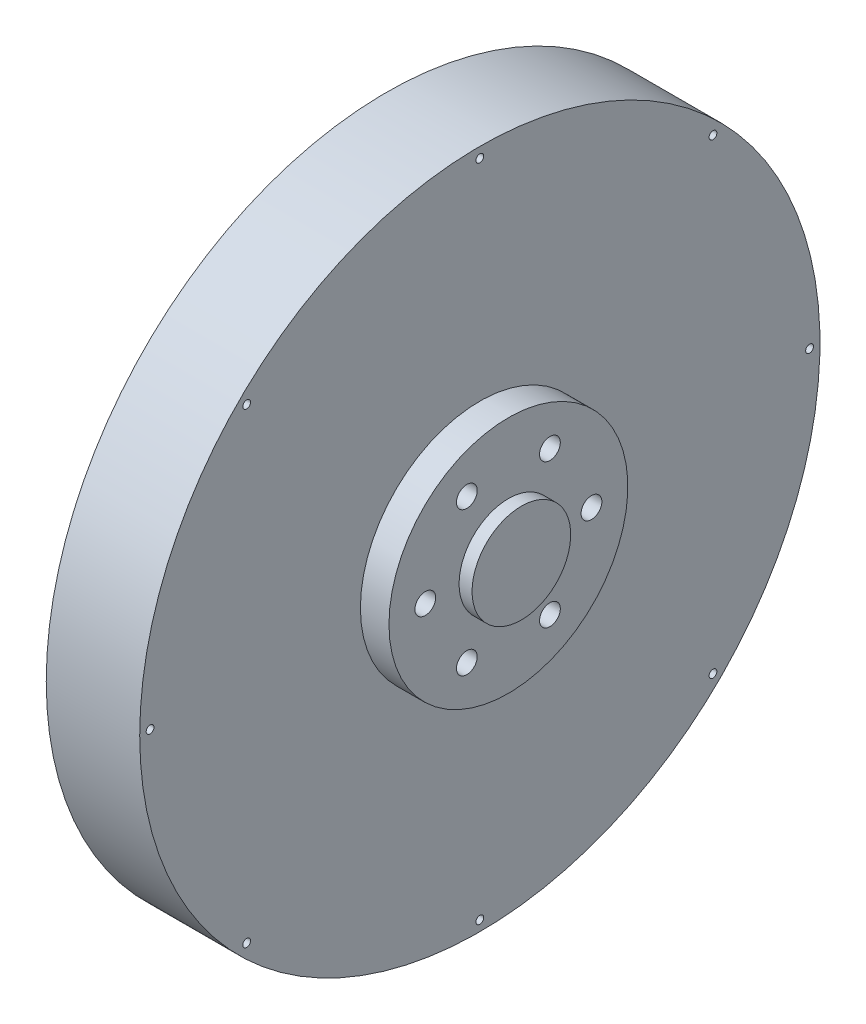
ISO-10303-21;
HEADER;
FILE_DESCRIPTION(('STEP AP214'),'2;1');
FILE_NAME('part.step','',(''),(''),'','','');
FILE_SCHEMA(('AUTOMOTIVE_DESIGN { 1 0 10303 214 1 1 1 1 }'));
ENDSEC;
DATA;
#1=APPLICATION_CONTEXT('core data for automotive mechanical design processes');
#2=APPLICATION_PROTOCOL_DEFINITION('international standard','automotive_design',2000,#1);
#3=PRODUCT_CONTEXT('',#1,'mechanical');
#4=PRODUCT('Part','Part','',(#3));
#5=PRODUCT_RELATED_PRODUCT_CATEGORY('part','',(#4));
#6=PRODUCT_DEFINITION_FORMATION('','',#4);
#7=PRODUCT_DEFINITION_CONTEXT('part definition',#1,'design');
#8=PRODUCT_DEFINITION('design','',#6,#7);
#9=PRODUCT_DEFINITION_SHAPE('','',#8);
#10=(LENGTH_UNIT() NAMED_UNIT(*) SI_UNIT(.MILLI.,.METRE.));
#11=(NAMED_UNIT(*) PLANE_ANGLE_UNIT() SI_UNIT($,.RADIAN.));
#12=(NAMED_UNIT(*) SI_UNIT($,.STERADIAN.) SOLID_ANGLE_UNIT());
#13=UNCERTAINTY_MEASURE_WITH_UNIT(LENGTH_MEASURE(1.E-05),#10,'distance_accuracy_value','');
#14=(GEOMETRIC_REPRESENTATION_CONTEXT(3) GLOBAL_UNCERTAINTY_ASSIGNED_CONTEXT((#13)) GLOBAL_UNIT_ASSIGNED_CONTEXT((#10,
#11,#12)) REPRESENTATION_CONTEXT('',''));
#15=CARTESIAN_POINT('',(0.,0.,0.));
#16=DIRECTION('',(0.,0.,1.));
#17=DIRECTION('',(1.,0.,0.));
#18=AXIS2_PLACEMENT_3D('',#15,#16,#17);
#19=CARTESIAN_POINT('',(11.,0.,0.));
#20=DIRECTION('',(1.,0.,0.));
#21=DIRECTION('',(0.,0.,1.));
#22=AXIS2_PLACEMENT_3D('',#19,#20,#21);
#23=PLANE('',#22);
#24=CARTESIAN_POINT('',(11.,-27.7128129211019,16.0000000000003));
#25=DIRECTION('',(-1.,0.,0.));
#26=DIRECTION('',(0.,-0.866025403784433,0.50000000000001));
#27=AXIS2_PLACEMENT_3D('',#24,#25,#26);
#28=CIRCLE('',#27,4.00000000000001);
#29=CARTESIAN_POINT('',(11.,-31.1769145362396,18.0000000000004));
#30=VERTEX_POINT('',#29);
#31=EDGE_CURVE('E142',#30,#30,#28,.T.);
#32=ORIENTED_EDGE('',*,*,#31,.T.);
#33=EDGE_LOOP('',(#32));
#34=FACE_BOUND('',#33,.T.);
#35=CARTESIAN_POINT('',(11.,-27.7128129211022,-15.9999999999997));
#36=DIRECTION('',(-1.,0.,0.));
#37=DIRECTION('',(0.,-0.866025403784443,-0.499999999999992));
#38=AXIS2_PLACEMENT_3D('',#35,#36,#37);
#39=CIRCLE('',#38,4.00000000000001);
#40=CARTESIAN_POINT('',(11.,-31.17691453624,-17.9999999999997));
#41=VERTEX_POINT('',#40);
#42=EDGE_CURVE('E136',#41,#41,#39,.T.);
#43=ORIENTED_EDGE('',*,*,#42,.T.);
#44=EDGE_LOOP('',(#43));
#45=FACE_BOUND('',#44,.T.);
#46=CARTESIAN_POINT('',(11.,0.,-32.));
#47=DIRECTION('',(-1.,0.,0.));
#48=DIRECTION('',(0.,0.,-1.));
#49=AXIS2_PLACEMENT_3D('',#46,#47,#48);
#50=CIRCLE('',#49,4.00000000000001);
#51=CARTESIAN_POINT('',(11.,0.,-36.));
#52=VERTEX_POINT('',#51);
#53=EDGE_CURVE('E130',#52,#52,#50,.T.);
#54=ORIENTED_EDGE('',*,*,#53,.T.);
#55=EDGE_LOOP('',(#54));
#56=FACE_BOUND('',#55,.T.);
#57=CARTESIAN_POINT('',(11.,27.712812921102,-16.0000000000001));
#58=DIRECTION('',(-1.,0.,0.));
#59=DIRECTION('',(0.,0.866025403784436,-0.500000000000004));
#60=AXIS2_PLACEMENT_3D('',#57,#58,#59);
#61=CIRCLE('',#60,4.00000000000001);
#62=CARTESIAN_POINT('',(11.,31.1769145362397,-18.0000000000002));
#63=VERTEX_POINT('',#62);
#64=EDGE_CURVE('E124',#63,#63,#61,.T.);
#65=ORIENTED_EDGE('',*,*,#64,.T.);
#66=EDGE_LOOP('',(#65));
#67=FACE_BOUND('',#66,.T.);
#68=CARTESIAN_POINT('',(11.,27.7128129211021,15.9999999999999));
#69=DIRECTION('',(-1.,0.,0.));
#70=DIRECTION('',(0.,0.86602540378444,0.499999999999998));
#71=AXIS2_PLACEMENT_3D('',#68,#69,#70);
#72=CIRCLE('',#71,4.00000000000001);
#73=CARTESIAN_POINT('',(11.,31.1769145362398,17.9999999999999));
#74=VERTEX_POINT('',#73);
#75=EDGE_CURVE('E118',#74,#74,#72,.T.);
#76=ORIENTED_EDGE('',*,*,#75,.T.);
#77=EDGE_LOOP('',(#76));
#78=FACE_BOUND('',#77,.T.);
#79=CARTESIAN_POINT('',(11.,0.,32.));
#80=DIRECTION('',(-1.,0.,0.));
#81=DIRECTION('',(0.,0.,1.));
#82=AXIS2_PLACEMENT_3D('',#79,#80,#81);
#83=CIRCLE('',#82,4.00000000000001);
#84=CARTESIAN_POINT('',(11.,0.,36.));
#85=VERTEX_POINT('',#84);
#86=EDGE_CURVE('E112',#85,#85,#83,.T.);
#87=ORIENTED_EDGE('',*,*,#86,.T.);
#88=EDGE_LOOP('',(#87));
#89=FACE_BOUND('',#88,.T.);
#90=CARTESIAN_POINT('',(11.,0.,0.));
#91=DIRECTION('',(-1.,0.,0.));
#92=DIRECTION('',(0.,0.,1.));
#93=AXIS2_PLACEMENT_3D('',#90,#91,#92);
#94=CIRCLE('',#93,46.);
#95=CARTESIAN_POINT('',(11.,0.,46.));
#96=VERTEX_POINT('',#95);
#97=EDGE_CURVE('E97',#96,#96,#94,.T.);
#98=ORIENTED_EDGE('',*,*,#97,.F.);
#99=EDGE_LOOP('',(#98));
#100=FACE_BOUND('',#99,.T.);
#101=CARTESIAN_POINT('',(11.,0.,0.));
#102=DIRECTION('',(-1.,0.,0.));
#103=DIRECTION('',(0.,0.,1.));
#104=AXIS2_PLACEMENT_3D('',#101,#102,#103);
#105=CIRCLE('',#104,19.);
#106=CARTESIAN_POINT('',(11.,0.,19.));
#107=VERTEX_POINT('',#106);
#108=EDGE_CURVE('E104',#107,#107,#105,.T.);
#109=ORIENTED_EDGE('',*,*,#108,.T.);
#110=EDGE_LOOP('',(#109));
#111=FACE_BOUND('',#110,.T.);
#112=ADVANCED_FACE('F35',(#34,#45,#56,#67,#78,#89,#100,#111),#23,.T.);
#113=CARTESIAN_POINT('',(0.,0.,0.));
#114=DIRECTION('',(1.,0.,0.));
#115=DIRECTION('',(0.,0.,1.));
#116=AXIS2_PLACEMENT_3D('',#113,#114,#115);
#117=PLANE('',#116);
#118=CARTESIAN_POINT('',(0.,-89.8025612106904,89.8025612106926));
#119=DIRECTION('',(-1.,0.,0.));
#120=DIRECTION('',(0.,-0.707106781186539,0.707106781186556));
#121=AXIS2_PLACEMENT_3D('',#118,#119,#120);
#122=CIRCLE('',#121,1.5);
#123=CARTESIAN_POINT('',(0.,-90.8632213824702,90.8632213824725));
#124=VERTEX_POINT('',#123);
#125=EDGE_CURVE('E190',#124,#124,#122,.T.);
#126=ORIENTED_EDGE('',*,*,#125,.T.);
#127=EDGE_LOOP('',(#126));
#128=FACE_BOUND('',#127,.T.);
#129=CARTESIAN_POINT('',(0.,-127.,1.33025439009923E-12));
#130=DIRECTION('',(-1.,0.,0.));
#131=DIRECTION('',(0.,-1.,0.));
#132=AXIS2_PLACEMENT_3D('',#129,#130,#131);
#133=CIRCLE('',#132,1.5);
#134=CARTESIAN_POINT('',(0.,-128.5,1.34596605612403E-12));
#135=VERTEX_POINT('',#134);
#136=EDGE_CURVE('E184',#135,#135,#133,.T.);
#137=ORIENTED_EDGE('',*,*,#136,.T.);
#138=EDGE_LOOP('',(#137));
#139=FACE_BOUND('',#138,.T.);
#140=CARTESIAN_POINT('',(0.,-89.8025612106923,-89.8025612106908));
#141=DIRECTION('',(-1.,0.,0.));
#142=DIRECTION('',(0.,-0.707106781186554,-0.707106781186541));
#143=AXIS2_PLACEMENT_3D('',#140,#141,#142);
#144=CIRCLE('',#143,1.5);
#145=CARTESIAN_POINT('',(0.,-90.8632213824721,-90.8632213824706));
#146=VERTEX_POINT('',#145);
#147=EDGE_CURVE('E178',#146,#146,#144,.T.);
#148=ORIENTED_EDGE('',*,*,#147,.T.);
#149=EDGE_LOOP('',(#148));
#150=FACE_BOUND('',#149,.T.);
#151=CARTESIAN_POINT('',(0.,0.,-127.));
#152=DIRECTION('',(-1.,0.,0.));
#153=DIRECTION('',(0.,0.,-1.));
#154=AXIS2_PLACEMENT_3D('',#151,#152,#153);
#155=CIRCLE('',#154,1.5);
#156=CARTESIAN_POINT('',(0.,0.,-128.5));
#157=VERTEX_POINT('',#156);
#158=EDGE_CURVE('E172',#157,#157,#155,.T.);
#159=ORIENTED_EDGE('',*,*,#158,.T.);
#160=EDGE_LOOP('',(#159));
#161=FACE_BOUND('',#160,.T.);
#162=CARTESIAN_POINT('',(0.,89.8025612106911,-89.802561210692));
#163=DIRECTION('',(-1.,0.,0.));
#164=DIRECTION('',(0.,0.707106781186544,-0.707106781186551));
#165=AXIS2_PLACEMENT_3D('',#162,#163,#164);
#166=CIRCLE('',#165,1.5);
#167=CARTESIAN_POINT('',(0.,90.8632213824709,-90.8632213824718));
#168=VERTEX_POINT('',#167);
#169=EDGE_CURVE('E166',#168,#168,#166,.T.);
#170=ORIENTED_EDGE('',*,*,#169,.T.);
#171=EDGE_LOOP('',(#170));
#172=FACE_BOUND('',#171,.T.);
#173=CARTESIAN_POINT('',(0.,127.,-4.43418130033078E-13));
#174=DIRECTION('',(-1.,0.,0.));
#175=DIRECTION('',(0.,1.,0.));
#176=AXIS2_PLACEMENT_3D('',#173,#174,#175);
#177=CIRCLE('',#176,1.5);
#178=CARTESIAN_POINT('',(0.,128.5,-4.48655352041343E-13));
#179=VERTEX_POINT('',#178);
#180=EDGE_CURVE('E160',#179,#179,#177,.T.);
#181=ORIENTED_EDGE('',*,*,#180,.T.);
#182=EDGE_LOOP('',(#181));
#183=FACE_BOUND('',#182,.T.);
#184=CARTESIAN_POINT('',(0.,89.8025612106917,89.8025612106914));
#185=DIRECTION('',(-1.,0.,0.));
#186=DIRECTION('',(0.,0.707106781186549,0.707106781186546));
#187=AXIS2_PLACEMENT_3D('',#184,#185,#186);
#188=CIRCLE('',#187,1.5);
#189=CARTESIAN_POINT('',(0.,90.8632213824715,90.8632213824712));
#190=VERTEX_POINT('',#189);
#191=EDGE_CURVE('E154',#190,#190,#188,.T.);
#192=ORIENTED_EDGE('',*,*,#191,.T.);
#193=EDGE_LOOP('',(#192));
#194=FACE_BOUND('',#193,.T.);
#195=CARTESIAN_POINT('',(0.,0.,127.));
#196=DIRECTION('',(-1.,0.,0.));
#197=DIRECTION('',(0.,0.,1.));
#198=AXIS2_PLACEMENT_3D('',#195,#196,#197);
#199=CIRCLE('',#198,1.5);
#200=CARTESIAN_POINT('',(0.,0.,128.5));
#201=VERTEX_POINT('',#200);
#202=EDGE_CURVE('E146',#201,#201,#199,.T.);
#203=ORIENTED_EDGE('',*,*,#202,.T.);
#204=EDGE_LOOP('',(#203));
#205=FACE_BOUND('',#204,.T.);
#206=CARTESIAN_POINT('',(0.,0.,0.));
#207=DIRECTION('',(-1.,0.,0.));
#208=DIRECTION('',(0.,0.,1.));
#209=AXIS2_PLACEMENT_3D('',#206,#207,#208);
#210=CIRCLE('',#209,131.);
#211=CARTESIAN_POINT('',(0.,0.,131.));
#212=VERTEX_POINT('',#211);
#213=EDGE_CURVE('E65',#212,#212,#210,.T.);
#214=ORIENTED_EDGE('',*,*,#213,.F.);
#215=EDGE_LOOP('',(#214));
#216=FACE_BOUND('',#215,.T.);
#217=CARTESIAN_POINT('',(0.,0.,0.));
#218=DIRECTION('',(-1.,0.,0.));
#219=DIRECTION('',(0.,0.,1.));
#220=AXIS2_PLACEMENT_3D('',#217,#218,#219);
#221=CIRCLE('',#220,46.);
#222=CARTESIAN_POINT('',(0.,0.,46.));
#223=VERTEX_POINT('',#222);
#224=EDGE_CURVE('E98',#223,#223,#221,.T.);
#225=ORIENTED_EDGE('',*,*,#224,.T.);
#226=EDGE_LOOP('',(#225));
#227=FACE_BOUND('',#226,.T.);
#228=ADVANCED_FACE('F194',(#128,#139,#150,#161,#172,#183,#194,#205,#216,#227),#117,.T.);
#229=CARTESIAN_POINT('',(-36.,0.,0.));
#230=DIRECTION('',(1.,0.,0.));
#231=DIRECTION('',(0.,0.,1.));
#232=AXIS2_PLACEMENT_3D('',#229,#230,#231);
#233=PLANE('',#232);
#234=CARTESIAN_POINT('',(-36.,-50.2294734194977,28.9999999999995));
#235=DIRECTION('',(-1.,0.,0.));
#236=DIRECTION('',(0.,0.,1.));
#237=AXIS2_PLACEMENT_3D('',#234,#235,#236);
#238=CIRCLE('',#237,4.);
#239=CARTESIAN_POINT('',(-36.,-50.2294734194977,32.9999999999995));
#240=VERTEX_POINT('',#239);
#241=EDGE_CURVE('E42',#240,#240,#238,.F.);
#242=ORIENTED_EDGE('',*,*,#241,.T.);
#243=EDGE_LOOP('',(#242));
#244=FACE_BOUND('',#243,.T.);
#245=CARTESIAN_POINT('',(-36.,50.2294734194973,29.0000000000002));
#246=DIRECTION('',(-1.,0.,0.));
#247=DIRECTION('',(0.,0.,1.));
#248=AXIS2_PLACEMENT_3D('',#245,#246,#247);
#249=CIRCLE('',#248,4.);
#250=CARTESIAN_POINT('',(-36.,50.2294734194973,33.0000000000002));
#251=VERTEX_POINT('',#250);
#252=EDGE_CURVE('E50',#251,#251,#249,.F.);
#253=ORIENTED_EDGE('',*,*,#252,.T.);
#254=EDGE_LOOP('',(#253));
#255=FACE_BOUND('',#254,.T.);
#256=CARTESIAN_POINT('',(-36.,0.,-58.));
#257=DIRECTION('',(-1.,0.,0.));
#258=DIRECTION('',(0.,0.,1.));
#259=AXIS2_PLACEMENT_3D('',#256,#257,#258);
#260=CIRCLE('',#259,4.);
#261=CARTESIAN_POINT('',(-36.,0.,-54.));
#262=VERTEX_POINT('',#261);
#263=EDGE_CURVE('E58',#262,#262,#260,.F.);
#264=ORIENTED_EDGE('',*,*,#263,.T.);
#265=EDGE_LOOP('',(#264));
#266=FACE_BOUND('',#265,.T.);
#267=CARTESIAN_POINT('',(-36.,0.,0.));
#268=DIRECTION('',(-1.,0.,0.));
#269=DIRECTION('',(0.,0.,1.));
#270=AXIS2_PLACEMENT_3D('',#267,#268,#269);
#271=CIRCLE('',#270,131.);
#272=CARTESIAN_POINT('',(-36.,0.,131.));
#273=VERTEX_POINT('',#272);
#274=EDGE_CURVE('E64',#273,#273,#271,.T.);
#275=ORIENTED_EDGE('',*,*,#274,.T.);
#276=EDGE_LOOP('',(#275));
#277=FACE_BOUND('',#276,.T.);
#278=CARTESIAN_POINT('',(-36.,0.,0.));
#279=DIRECTION('',(-1.,0.,0.));
#280=DIRECTION('',(0.,0.,1.));
#281=AXIS2_PLACEMENT_3D('',#278,#279,#280);
#282=CIRCLE('',#281,47.);
#283=CARTESIAN_POINT('',(-36.,0.,47.));
#284=VERTEX_POINT('',#283);
#285=EDGE_CURVE('E61',#284,#284,#282,.F.);
#286=ORIENTED_EDGE('',*,*,#285,.T.);
#287=EDGE_LOOP('',(#286));
#288=FACE_BOUND('',#287,.T.);
#289=CARTESIAN_POINT('',(-36.,50.2294734194975,-28.9999999999999));
#290=DIRECTION('',(-1.,0.,0.));
#291=DIRECTION('',(0.,0.,1.));
#292=AXIS2_PLACEMENT_3D('',#289,#290,#291);
#293=CIRCLE('',#292,4.);
#294=CARTESIAN_POINT('',(-36.,50.2294734194975,-24.9999999999999));
#295=VERTEX_POINT('',#294);
#296=EDGE_CURVE('E55',#295,#295,#293,.F.);
#297=ORIENTED_EDGE('',*,*,#296,.T.);
#298=EDGE_LOOP('',(#297));
#299=FACE_BOUND('',#298,.T.);
#300=CARTESIAN_POINT('',(-36.,0.,58.));
#301=DIRECTION('',(-1.,0.,0.));
#302=DIRECTION('',(0.,0.,1.));
#303=AXIS2_PLACEMENT_3D('',#300,#301,#302);
#304=CIRCLE('',#303,4.);
#305=CARTESIAN_POINT('',(-36.,0.,62.));
#306=VERTEX_POINT('',#305);
#307=EDGE_CURVE('E46',#306,#306,#304,.F.);
#308=ORIENTED_EDGE('',*,*,#307,.T.);
#309=EDGE_LOOP('',(#308));
#310=FACE_BOUND('',#309,.T.);
#311=CARTESIAN_POINT('',(-36.,-50.2294734194971,-29.0000000000006));
#312=DIRECTION('',(-1.,0.,0.));
#313=DIRECTION('',(0.,0.,1.));
#314=AXIS2_PLACEMENT_3D('',#311,#312,#313);
#315=CIRCLE('',#314,4.);
#316=CARTESIAN_POINT('',(-36.,-50.2294734194971,-25.0000000000006));
#317=VERTEX_POINT('',#316);
#318=EDGE_CURVE('E10',#317,#317,#315,.F.);
#319=ORIENTED_EDGE('',*,*,#318,.T.);
#320=EDGE_LOOP('',(#319));
#321=FACE_BOUND('',#320,.T.);
#322=ADVANCED_FACE('F218',(#244,#255,#266,#277,#288,#299,#310,#321),#233,.F.);
#323=CARTESIAN_POINT('',(-57.5,0.,0.));
#324=DIRECTION('',(-1.,0.,0.));
#325=DIRECTION('',(0.,0.,-1.));
#326=AXIS2_PLACEMENT_3D('',#323,#324,#325);
#327=PLANE('',#326);
#328=CARTESIAN_POINT('',(-57.5,0.,0.));
#329=DIRECTION('',(1.,0.,0.));
#330=DIRECTION('',(0.,0.,-1.));
#331=AXIS2_PLACEMENT_3D('',#328,#329,#330);
#332=CIRCLE('',#331,47.);
#333=CARTESIAN_POINT('',(-57.5,0.,-47.));
#334=VERTEX_POINT('',#333);
#335=EDGE_CURVE('E68',#334,#334,#332,.T.);
#336=ORIENTED_EDGE('',*,*,#335,.F.);
#337=EDGE_LOOP('',(#336));
#338=FACE_BOUND('',#337,.T.);
#339=CARTESIAN_POINT('',(-57.5,0.,0.));
#340=DIRECTION('',(1.,0.,0.));
#341=DIRECTION('',(0.,0.,-1.));
#342=AXIS2_PLACEMENT_3D('',#339,#340,#341);
#343=CIRCLE('',#342,36.5);
#344=CARTESIAN_POINT('',(-57.5,0.,-36.5));
#345=VERTEX_POINT('',#344);
#346=EDGE_CURVE('E74',#345,#345,#343,.T.);
#347=ORIENTED_EDGE('',*,*,#346,.T.);
#348=EDGE_LOOP('',(#347));
#349=FACE_BOUND('',#348,.T.);
#350=ADVANCED_FACE('F285',(#338,#349),#327,.T.);
#351=CARTESIAN_POINT('',(-36.,0.,0.));
#352=DIRECTION('',(1.,0.,0.));
#353=DIRECTION('',(0.,0.,1.));
#354=AXIS2_PLACEMENT_3D('',#351,#352,#353);
#355=CYLINDRICAL_SURFACE('',#354,131.);
#356=ORIENTED_EDGE('',*,*,#274,.F.);
#357=EDGE_LOOP('',(#356));
#358=FACE_BOUND('',#357,.T.);
#359=ORIENTED_EDGE('',*,*,#213,.T.);
#360=EDGE_LOOP('',(#359));
#361=FACE_BOUND('',#360,.T.);
#362=ADVANCED_FACE('F37',(#358,#361),#355,.T.);
#363=CARTESIAN_POINT('',(-57.5,0.,0.));
#364=DIRECTION('',(1.,0.,0.));
#365=DIRECTION('',(0.,0.,1.));
#366=AXIS2_PLACEMENT_3D('',#363,#364,#365);
#367=CYLINDRICAL_SURFACE('',#366,47.);
#368=ORIENTED_EDGE('',*,*,#335,.T.);
#369=EDGE_LOOP('',(#368));
#370=FACE_BOUND('',#369,.T.);
#371=ORIENTED_EDGE('',*,*,#285,.F.);
#372=EDGE_LOOP('',(#371));
#373=FACE_BOUND('',#372,.T.);
#374=ADVANCED_FACE('F283',(#370,#373),#367,.T.);
#375=CARTESIAN_POINT('',(-70.,0.,0.));
#376=DIRECTION('',(1.,0.,0.));
#377=DIRECTION('',(0.,0.,1.));
#378=AXIS2_PLACEMENT_3D('',#375,#376,#377);
#379=CYLINDRICAL_SURFACE('',#378,36.5);
#380=CARTESIAN_POINT('',(-70.,0.,0.));
#381=DIRECTION('',(1.,0.,0.));
#382=DIRECTION('',(0.,0.,-1.));
#383=AXIS2_PLACEMENT_3D('',#380,#381,#382);
#384=CIRCLE('',#383,36.5);
#385=CARTESIAN_POINT('',(-70.,0.,-36.5));
#386=VERTEX_POINT('',#385);
#387=EDGE_CURVE('E73',#386,#386,#384,.T.);
#388=ORIENTED_EDGE('',*,*,#387,.T.);
#389=EDGE_LOOP('',(#388));
#390=FACE_BOUND('',#389,.T.);
#391=ORIENTED_EDGE('',*,*,#346,.F.);
#392=EDGE_LOOP('',(#391));
#393=FACE_BOUND('',#392,.T.);
#394=ADVANCED_FACE('F279',(#390,#393),#379,.T.);
#395=CARTESIAN_POINT('',(-70.,0.,0.));
#396=DIRECTION('',(-1.,0.,0.));
#397=DIRECTION('',(0.,0.,-1.));
#398=AXIS2_PLACEMENT_3D('',#395,#396,#397);
#399=PLANE('',#398);
#400=ORIENTED_EDGE('',*,*,#387,.F.);
#401=EDGE_LOOP('',(#400));
#402=FACE_BOUND('',#401,.T.);
#403=ADVANCED_FACE('F275',(#402),#399,.T.);
#404=CARTESIAN_POINT('',(-40.,0.,-58.));
#405=DIRECTION('',(1.,0.,0.));
#406=DIRECTION('',(0.,0.,1.));
#407=AXIS2_PLACEMENT_3D('',#404,#405,#406);
#408=CYLINDRICAL_SURFACE('',#407,4.);
#409=CARTESIAN_POINT('',(-40.,0.,-58.));
#410=DIRECTION('',(1.,0.,0.));
#411=DIRECTION('',(0.,0.,-1.));
#412=AXIS2_PLACEMENT_3D('',#409,#410,#411);
#413=CIRCLE('',#412,4.);
#414=CARTESIAN_POINT('',(-40.,0.,-62.));
#415=VERTEX_POINT('',#414);
#416=EDGE_CURVE('E77',#415,#415,#413,.T.);
#417=ORIENTED_EDGE('',*,*,#416,.T.);
#418=EDGE_LOOP('',(#417));
#419=FACE_BOUND('',#418,.T.);
#420=ORIENTED_EDGE('',*,*,#263,.F.);
#421=EDGE_LOOP('',(#420));
#422=FACE_BOUND('',#421,.T.);
#423=ADVANCED_FACE('F271',(#419,#422),#408,.T.);
#424=CARTESIAN_POINT('',(-40.,0.,-58.));
#425=DIRECTION('',(-1.,0.,0.));
#426=DIRECTION('',(0.,0.,-1.));
#427=AXIS2_PLACEMENT_3D('',#424,#425,#426);
#428=PLANE('',#427);
#429=ORIENTED_EDGE('',*,*,#416,.F.);
#430=EDGE_LOOP('',(#429));
#431=FACE_BOUND('',#430,.T.);
#432=ADVANCED_FACE('F267',(#431),#428,.T.);
#433=CARTESIAN_POINT('',(-40.,50.2294734194975,-28.9999999999999));
#434=DIRECTION('',(1.,0.,0.));
#435=DIRECTION('',(0.,-0.86602540378444,0.499999999999998));
#436=AXIS2_PLACEMENT_3D('',#433,#434,#435);
#437=CYLINDRICAL_SURFACE('',#436,4.);
#438=CARTESIAN_POINT('',(-40.,50.2294734194975,-28.9999999999999));
#439=DIRECTION('',(1.,0.,0.));
#440=DIRECTION('',(0.,0.86602540378444,-0.499999999999998));
#441=AXIS2_PLACEMENT_3D('',#438,#439,#440);
#442=CIRCLE('',#441,4.);
#443=CARTESIAN_POINT('',(-40.,53.6935750346353,-30.9999999999999));
#444=VERTEX_POINT('',#443);
#445=EDGE_CURVE('E82',#444,#444,#442,.T.);
#446=ORIENTED_EDGE('',*,*,#445,.T.);
#447=EDGE_LOOP('',(#446));
#448=FACE_BOUND('',#447,.T.);
#449=ORIENTED_EDGE('',*,*,#296,.F.);
#450=EDGE_LOOP('',(#449));
#451=FACE_BOUND('',#450,.T.);
#452=ADVANCED_FACE('F263',(#448,#451),#437,.T.);
#453=CARTESIAN_POINT('',(-40.,50.2294734194975,-28.9999999999999));
#454=DIRECTION('',(-1.,0.,0.));
#455=DIRECTION('',(0.,0.86602540378444,-0.499999999999998));
#456=AXIS2_PLACEMENT_3D('',#453,#454,#455);
#457=PLANE('',#456);
#458=ORIENTED_EDGE('',*,*,#445,.F.);
#459=EDGE_LOOP('',(#458));
#460=FACE_BOUND('',#459,.T.);
#461=ADVANCED_FACE('F259',(#460),#457,.T.);
#462=CARTESIAN_POINT('',(-40.,50.2294734194973,29.0000000000002));
#463=DIRECTION('',(1.,0.,0.));
#464=DIRECTION('',(0.,-0.866025403784436,-0.500000000000004));
#465=AXIS2_PLACEMENT_3D('',#462,#463,#464);
#466=CYLINDRICAL_SURFACE('',#465,4.);
#467=CARTESIAN_POINT('',(-40.,50.2294734194973,29.0000000000002));
#468=DIRECTION('',(1.,0.,0.));
#469=DIRECTION('',(0.,0.866025403784436,0.500000000000004));
#470=AXIS2_PLACEMENT_3D('',#467,#468,#469);
#471=CIRCLE('',#470,4.);
#472=CARTESIAN_POINT('',(-40.,53.6935750346351,31.0000000000003));
#473=VERTEX_POINT('',#472);
#474=EDGE_CURVE('E85',#473,#473,#471,.T.);
#475=ORIENTED_EDGE('',*,*,#474,.T.);
#476=EDGE_LOOP('',(#475));
#477=FACE_BOUND('',#476,.T.);
#478=ORIENTED_EDGE('',*,*,#252,.F.);
#479=EDGE_LOOP('',(#478));
#480=FACE_BOUND('',#479,.T.);
#481=ADVANCED_FACE('F255',(#477,#480),#466,.T.);
#482=CARTESIAN_POINT('',(-40.,50.2294734194973,29.0000000000002));
#483=DIRECTION('',(-1.,0.,0.));
#484=DIRECTION('',(0.,0.866025403784436,0.500000000000004));
#485=AXIS2_PLACEMENT_3D('',#482,#483,#484);
#486=PLANE('',#485);
#487=ORIENTED_EDGE('',*,*,#474,.F.);
#488=EDGE_LOOP('',(#487));
#489=FACE_BOUND('',#488,.T.);
#490=ADVANCED_FACE('F251',(#489),#486,.T.);
#491=CARTESIAN_POINT('',(-40.,0.,58.));
#492=DIRECTION('',(1.,0.,0.));
#493=DIRECTION('',(0.,0.,-1.));
#494=AXIS2_PLACEMENT_3D('',#491,#492,#493);
#495=CYLINDRICAL_SURFACE('',#494,4.);
#496=CARTESIAN_POINT('',(-40.,0.,58.));
#497=DIRECTION('',(1.,0.,0.));
#498=DIRECTION('',(0.,0.,1.));
#499=AXIS2_PLACEMENT_3D('',#496,#497,#498);
#500=CIRCLE('',#499,4.);
#501=CARTESIAN_POINT('',(-40.,0.,62.));
#502=VERTEX_POINT('',#501);
#503=EDGE_CURVE('E88',#502,#502,#500,.T.);
#504=ORIENTED_EDGE('',*,*,#503,.T.);
#505=EDGE_LOOP('',(#504));
#506=FACE_BOUND('',#505,.T.);
#507=ORIENTED_EDGE('',*,*,#307,.F.);
#508=EDGE_LOOP('',(#507));
#509=FACE_BOUND('',#508,.T.);
#510=ADVANCED_FACE('F247',(#506,#509),#495,.T.);
#511=CARTESIAN_POINT('',(-40.,0.,58.));
#512=DIRECTION('',(-1.,0.,0.));
#513=DIRECTION('',(0.,0.,1.));
#514=AXIS2_PLACEMENT_3D('',#511,#512,#513);
#515=PLANE('',#514);
#516=ORIENTED_EDGE('',*,*,#503,.F.);
#517=EDGE_LOOP('',(#516));
#518=FACE_BOUND('',#517,.T.);
#519=ADVANCED_FACE('F243',(#518),#515,.T.);
#520=CARTESIAN_POINT('',(-40.,-50.2294734194977,28.9999999999995));
#521=DIRECTION('',(1.,0.,0.));
#522=DIRECTION('',(0.,0.866025403784443,-0.499999999999992));
#523=AXIS2_PLACEMENT_3D('',#520,#521,#522);
#524=CYLINDRICAL_SURFACE('',#523,4.);
#525=CARTESIAN_POINT('',(-40.,-50.2294734194977,28.9999999999995));
#526=DIRECTION('',(1.,0.,0.));
#527=DIRECTION('',(0.,-0.866025403784443,0.499999999999992));
#528=AXIS2_PLACEMENT_3D('',#525,#526,#527);
#529=CIRCLE('',#528,4.);
#530=CARTESIAN_POINT('',(-40.,-53.6935750346355,30.9999999999995));
#531=VERTEX_POINT('',#530);
#532=EDGE_CURVE('E91',#531,#531,#529,.T.);
#533=ORIENTED_EDGE('',*,*,#532,.T.);
#534=EDGE_LOOP('',(#533));
#535=FACE_BOUND('',#534,.T.);
#536=ORIENTED_EDGE('',*,*,#241,.F.);
#537=EDGE_LOOP('',(#536));
#538=FACE_BOUND('',#537,.T.);
#539=ADVANCED_FACE('F239',(#535,#538),#524,.T.);
#540=CARTESIAN_POINT('',(-40.,-50.2294734194977,28.9999999999995));
#541=DIRECTION('',(-1.,0.,0.));
#542=DIRECTION('',(0.,-0.866025403784443,0.499999999999992));
#543=AXIS2_PLACEMENT_3D('',#540,#541,#542);
#544=PLANE('',#543);
#545=ORIENTED_EDGE('',*,*,#532,.F.);
#546=EDGE_LOOP('',(#545));
#547=FACE_BOUND('',#546,.T.);
#548=ADVANCED_FACE('F235',(#547),#544,.T.);
#549=CARTESIAN_POINT('',(-40.,-50.2294734194971,-29.0000000000006));
#550=DIRECTION('',(1.,0.,0.));
#551=DIRECTION('',(0.,0.866025403784433,0.50000000000001));
#552=AXIS2_PLACEMENT_3D('',#549,#550,#551);
#553=CYLINDRICAL_SURFACE('',#552,4.);
#554=CARTESIAN_POINT('',(-40.,-50.2294734194971,-29.0000000000006));
#555=DIRECTION('',(1.,0.,0.));
#556=DIRECTION('',(0.,-0.866025403784433,-0.50000000000001));
#557=AXIS2_PLACEMENT_3D('',#554,#555,#556);
#558=CIRCLE('',#557,4.);
#559=CARTESIAN_POINT('',(-40.,-53.6935750346348,-31.0000000000006));
#560=VERTEX_POINT('',#559);
#561=EDGE_CURVE('E94',#560,#560,#558,.T.);
#562=ORIENTED_EDGE('',*,*,#561,.T.);
#563=EDGE_LOOP('',(#562));
#564=FACE_BOUND('',#563,.T.);
#565=ORIENTED_EDGE('',*,*,#318,.F.);
#566=EDGE_LOOP('',(#565));
#567=FACE_BOUND('',#566,.T.);
#568=ADVANCED_FACE('F231',(#564,#567),#553,.T.);
#569=CARTESIAN_POINT('',(-40.,-50.2294734194971,-29.0000000000006));
#570=DIRECTION('',(-1.,0.,0.));
#571=DIRECTION('',(0.,-0.866025403784433,-0.50000000000001));
#572=AXIS2_PLACEMENT_3D('',#569,#570,#571);
#573=PLANE('',#572);
#574=ORIENTED_EDGE('',*,*,#561,.F.);
#575=EDGE_LOOP('',(#574));
#576=FACE_BOUND('',#575,.T.);
#577=ADVANCED_FACE('F227',(#576),#573,.T.);
#578=CARTESIAN_POINT('',(11.,0.,0.));
#579=DIRECTION('',(-1.,0.,0.));
#580=DIRECTION('',(0.,0.,-1.));
#581=AXIS2_PLACEMENT_3D('',#578,#579,#580);
#582=CYLINDRICAL_SURFACE('',#581,46.);
#583=ORIENTED_EDGE('',*,*,#97,.T.);
#584=EDGE_LOOP('',(#583));
#585=FACE_BOUND('',#584,.T.);
#586=ORIENTED_EDGE('',*,*,#224,.F.);
#587=EDGE_LOOP('',(#586));
#588=FACE_BOUND('',#587,.T.);
#589=ADVANCED_FACE('F224',(#585,#588),#582,.T.);
#590=CARTESIAN_POINT('',(16.,0.,0.));
#591=DIRECTION('',(-1.,0.,0.));
#592=DIRECTION('',(0.,0.,-1.));
#593=AXIS2_PLACEMENT_3D('',#590,#591,#592);
#594=CYLINDRICAL_SURFACE('',#593,19.);
#595=CARTESIAN_POINT('',(16.,0.,0.));
#596=DIRECTION('',(-1.,0.,0.));
#597=DIRECTION('',(0.,0.,1.));
#598=AXIS2_PLACEMENT_3D('',#595,#596,#597);
#599=CIRCLE('',#598,19.);
#600=CARTESIAN_POINT('',(16.,0.,19.));
#601=VERTEX_POINT('',#600);
#602=EDGE_CURVE('E101',#601,#601,#599,.T.);
#603=ORIENTED_EDGE('',*,*,#602,.T.);
#604=EDGE_LOOP('',(#603));
#605=FACE_BOUND('',#604,.T.);
#606=ORIENTED_EDGE('',*,*,#108,.F.);
#607=EDGE_LOOP('',(#606));
#608=FACE_BOUND('',#607,.T.);
#609=ADVANCED_FACE('F222',(#605,#608),#594,.T.);
#610=CARTESIAN_POINT('',(16.,0.,0.));
#611=DIRECTION('',(1.,0.,0.));
#612=DIRECTION('',(0.,0.,1.));
#613=AXIS2_PLACEMENT_3D('',#610,#611,#612);
#614=PLANE('',#613);
#615=ORIENTED_EDGE('',*,*,#602,.F.);
#616=EDGE_LOOP('',(#615));
#617=FACE_BOUND('',#616,.T.);
#618=ADVANCED_FACE('F392',(#617),#614,.T.);
#619=CARTESIAN_POINT('',(-11.3137084989848,0.,32.));
#620=DIRECTION('',(1.,0.,0.));
#621=DIRECTION('',(0.,0.,1.));
#622=AXIS2_PLACEMENT_3D('',#619,#620,#621);
#623=CYLINDRICAL_SURFACE('',#622,4.00000000000001);
#624=CARTESIAN_POINT('',(0.,0.,32.));
#625=DIRECTION('',(-1.,0.,0.));
#626=DIRECTION('',(0.,0.,1.));
#627=AXIS2_PLACEMENT_3D('',#624,#625,#626);
#628=CIRCLE('',#627,4.00000000000001);
#629=CARTESIAN_POINT('',(0.,0.,36.));
#630=VERTEX_POINT('',#629);
#631=EDGE_CURVE('E107',#630,#630,#628,.F.);
#632=ORIENTED_EDGE('',*,*,#631,.F.);
#633=EDGE_LOOP('',(#632));
#634=FACE_BOUND('',#633,.T.);
#635=ORIENTED_EDGE('',*,*,#86,.F.);
#636=EDGE_LOOP('',(#635));
#637=FACE_BOUND('',#636,.T.);
#638=ADVANCED_FACE('F399',(#634,#637),#623,.F.);
#639=CARTESIAN_POINT('',(0.,0.,0.));
#640=DIRECTION('',(1.,0.,0.));
#641=DIRECTION('',(0.,0.,1.));
#642=AXIS2_PLACEMENT_3D('',#639,#640,#641);
#643=PLANE('',#642);
#644=ORIENTED_EDGE('',*,*,#631,.T.);
#645=EDGE_LOOP('',(#644));
#646=FACE_BOUND('',#645,.T.);
#647=ADVANCED_FACE('F406',(#646),#643,.T.);
#648=CARTESIAN_POINT('',(-11.3137084989848,27.7128129211021,15.9999999999999));
#649=DIRECTION('',(1.,0.,0.));
#650=DIRECTION('',(0.,0.86602540378444,0.499999999999998));
#651=AXIS2_PLACEMENT_3D('',#648,#649,#650);
#652=CYLINDRICAL_SURFACE('',#651,4.00000000000001);
#653=CARTESIAN_POINT('',(0.,27.7128129211021,15.9999999999999));
#654=DIRECTION('',(-1.,0.,0.));
#655=DIRECTION('',(0.,0.86602540378444,0.499999999999998));
#656=AXIS2_PLACEMENT_3D('',#653,#654,#655);
#657=CIRCLE('',#656,4.00000000000001);
#658=CARTESIAN_POINT('',(0.,31.1769145362398,17.9999999999999));
#659=VERTEX_POINT('',#658);
#660=EDGE_CURVE('E115',#659,#659,#657,.F.);
#661=ORIENTED_EDGE('',*,*,#660,.F.);
#662=EDGE_LOOP('',(#661));
#663=FACE_BOUND('',#662,.T.);
#664=ORIENTED_EDGE('',*,*,#75,.F.);
#665=EDGE_LOOP('',(#664));
#666=FACE_BOUND('',#665,.T.);
#667=ADVANCED_FACE('F414',(#663,#666),#652,.F.);
#668=CARTESIAN_POINT('',(0.,0.,0.));
#669=DIRECTION('',(1.,0.,0.));
#670=DIRECTION('',(0.,0.86602540378444,0.499999999999998));
#671=AXIS2_PLACEMENT_3D('',#668,#669,#670);
#672=PLANE('',#671);
#673=ORIENTED_EDGE('',*,*,#660,.T.);
#674=EDGE_LOOP('',(#673));
#675=FACE_BOUND('',#674,.T.);
#676=ADVANCED_FACE('F422',(#675),#672,.T.);
#677=CARTESIAN_POINT('',(-11.3137084989848,27.712812921102,-16.0000000000001));
#678=DIRECTION('',(1.,0.,0.));
#679=DIRECTION('',(0.,0.866025403784436,-0.500000000000004));
#680=AXIS2_PLACEMENT_3D('',#677,#678,#679);
#681=CYLINDRICAL_SURFACE('',#680,4.00000000000001);
#682=CARTESIAN_POINT('',(0.,27.712812921102,-16.0000000000001));
#683=DIRECTION('',(-1.,0.,0.));
#684=DIRECTION('',(0.,0.866025403784436,-0.500000000000004));
#685=AXIS2_PLACEMENT_3D('',#682,#683,#684);
#686=CIRCLE('',#685,4.00000000000001);
#687=CARTESIAN_POINT('',(0.,31.1769145362397,-18.0000000000002));
#688=VERTEX_POINT('',#687);
#689=EDGE_CURVE('E121',#688,#688,#686,.F.);
#690=ORIENTED_EDGE('',*,*,#689,.F.);
#691=EDGE_LOOP('',(#690));
#692=FACE_BOUND('',#691,.T.);
#693=ORIENTED_EDGE('',*,*,#64,.F.);
#694=EDGE_LOOP('',(#693));
#695=FACE_BOUND('',#694,.T.);
#696=ADVANCED_FACE('F430',(#692,#695),#681,.F.);
#697=CARTESIAN_POINT('',(0.,0.,0.));
#698=DIRECTION('',(1.,0.,0.));
#699=DIRECTION('',(0.,0.866025403784436,-0.500000000000004));
#700=AXIS2_PLACEMENT_3D('',#697,#698,#699);
#701=PLANE('',#700);
#702=ORIENTED_EDGE('',*,*,#689,.T.);
#703=EDGE_LOOP('',(#702));
#704=FACE_BOUND('',#703,.T.);
#705=ADVANCED_FACE('F438',(#704),#701,.T.);
#706=CARTESIAN_POINT('',(-11.3137084989848,0.,-32.));
#707=DIRECTION('',(1.,0.,0.));
#708=DIRECTION('',(0.,0.,-1.));
#709=AXIS2_PLACEMENT_3D('',#706,#707,#708);
#710=CYLINDRICAL_SURFACE('',#709,4.00000000000001);
#711=CARTESIAN_POINT('',(0.,0.,-32.));
#712=DIRECTION('',(-1.,0.,0.));
#713=DIRECTION('',(0.,0.,-1.));
#714=AXIS2_PLACEMENT_3D('',#711,#712,#713);
#715=CIRCLE('',#714,4.00000000000001);
#716=CARTESIAN_POINT('',(0.,0.,-36.));
#717=VERTEX_POINT('',#716);
#718=EDGE_CURVE('E127',#717,#717,#715,.F.);
#719=ORIENTED_EDGE('',*,*,#718,.F.);
#720=EDGE_LOOP('',(#719));
#721=FACE_BOUND('',#720,.T.);
#722=ORIENTED_EDGE('',*,*,#53,.F.);
#723=EDGE_LOOP('',(#722));
#724=FACE_BOUND('',#723,.T.);
#725=ADVANCED_FACE('F446',(#721,#724),#710,.F.);
#726=CARTESIAN_POINT('',(0.,0.,0.));
#727=DIRECTION('',(1.,0.,0.));
#728=DIRECTION('',(0.,0.,-1.));
#729=AXIS2_PLACEMENT_3D('',#726,#727,#728);
#730=PLANE('',#729);
#731=ORIENTED_EDGE('',*,*,#718,.T.);
#732=EDGE_LOOP('',(#731));
#733=FACE_BOUND('',#732,.T.);
#734=ADVANCED_FACE('F454',(#733),#730,.T.);
#735=CARTESIAN_POINT('',(-11.3137084989848,-27.7128129211022,-15.9999999999997));
#736=DIRECTION('',(1.,0.,0.));
#737=DIRECTION('',(0.,-0.866025403784443,-0.499999999999992));
#738=AXIS2_PLACEMENT_3D('',#735,#736,#737);
#739=CYLINDRICAL_SURFACE('',#738,4.00000000000001);
#740=CARTESIAN_POINT('',(0.,-27.7128129211022,-15.9999999999997));
#741=DIRECTION('',(-1.,0.,0.));
#742=DIRECTION('',(0.,-0.866025403784443,-0.499999999999992));
#743=AXIS2_PLACEMENT_3D('',#740,#741,#742);
#744=CIRCLE('',#743,4.00000000000001);
#745=CARTESIAN_POINT('',(0.,-31.17691453624,-17.9999999999997));
#746=VERTEX_POINT('',#745);
#747=EDGE_CURVE('E133',#746,#746,#744,.F.);
#748=ORIENTED_EDGE('',*,*,#747,.F.);
#749=EDGE_LOOP('',(#748));
#750=FACE_BOUND('',#749,.T.);
#751=ORIENTED_EDGE('',*,*,#42,.F.);
#752=EDGE_LOOP('',(#751));
#753=FACE_BOUND('',#752,.T.);
#754=ADVANCED_FACE('F462',(#750,#753),#739,.F.);
#755=CARTESIAN_POINT('',(0.,0.,0.));
#756=DIRECTION('',(1.,0.,0.));
#757=DIRECTION('',(0.,-0.866025403784443,-0.499999999999992));
#758=AXIS2_PLACEMENT_3D('',#755,#756,#757);
#759=PLANE('',#758);
#760=ORIENTED_EDGE('',*,*,#747,.T.);
#761=EDGE_LOOP('',(#760));
#762=FACE_BOUND('',#761,.T.);
#763=ADVANCED_FACE('F470',(#762),#759,.T.);
#764=CARTESIAN_POINT('',(-11.3137084989848,-27.7128129211019,16.0000000000003));
#765=DIRECTION('',(1.,0.,0.));
#766=DIRECTION('',(0.,-0.866025403784433,0.50000000000001));
#767=AXIS2_PLACEMENT_3D('',#764,#765,#766);
#768=CYLINDRICAL_SURFACE('',#767,4.00000000000001);
#769=CARTESIAN_POINT('',(0.,-27.7128129211019,16.0000000000003));
#770=DIRECTION('',(-1.,0.,0.));
#771=DIRECTION('',(0.,-0.866025403784433,0.50000000000001));
#772=AXIS2_PLACEMENT_3D('',#769,#770,#771);
#773=CIRCLE('',#772,4.00000000000001);
#774=CARTESIAN_POINT('',(0.,-31.1769145362396,18.0000000000004));
#775=VERTEX_POINT('',#774);
#776=EDGE_CURVE('E139',#775,#775,#773,.F.);
#777=ORIENTED_EDGE('',*,*,#776,.F.);
#778=EDGE_LOOP('',(#777));
#779=FACE_BOUND('',#778,.T.);
#780=ORIENTED_EDGE('',*,*,#31,.F.);
#781=EDGE_LOOP('',(#780));
#782=FACE_BOUND('',#781,.T.);
#783=ADVANCED_FACE('F478',(#779,#782),#768,.F.);
#784=CARTESIAN_POINT('',(0.,0.,0.));
#785=DIRECTION('',(1.,0.,0.));
#786=DIRECTION('',(0.,-0.866025403784433,0.50000000000001));
#787=AXIS2_PLACEMENT_3D('',#784,#785,#786);
#788=PLANE('',#787);
#789=ORIENTED_EDGE('',*,*,#776,.T.);
#790=EDGE_LOOP('',(#789));
#791=FACE_BOUND('',#790,.T.);
#792=ADVANCED_FACE('F486',(#791),#788,.T.);
#793=CARTESIAN_POINT('',(-5.,0.,127.));
#794=DIRECTION('',(1.,0.,0.));
#795=DIRECTION('',(0.,0.,1.));
#796=AXIS2_PLACEMENT_3D('',#793,#794,#795);
#797=CYLINDRICAL_SURFACE('',#796,1.5);
#798=CARTESIAN_POINT('',(-5.,0.,127.));
#799=DIRECTION('',(-1.,0.,0.));
#800=DIRECTION('',(0.,0.,1.));
#801=AXIS2_PLACEMENT_3D('',#798,#799,#800);
#802=CIRCLE('',#801,1.5);
#803=CARTESIAN_POINT('',(-5.,0.,128.5));
#804=VERTEX_POINT('',#803);
#805=EDGE_CURVE('E145',#804,#804,#802,.T.);
#806=ORIENTED_EDGE('',*,*,#805,.T.);
#807=EDGE_LOOP('',(#806));
#808=FACE_BOUND('',#807,.T.);
#809=ORIENTED_EDGE('',*,*,#202,.F.);
#810=EDGE_LOOP('',(#809));
#811=FACE_BOUND('',#810,.T.);
#812=ADVANCED_FACE('F494',(#808,#811),#797,.F.);
#813=CARTESIAN_POINT('',(-5.,0.,127.));
#814=DIRECTION('',(1.,0.,0.));
#815=DIRECTION('',(0.,0.,1.));
#816=AXIS2_PLACEMENT_3D('',#813,#814,#815);
#817=PLANE('',#816);
#818=ORIENTED_EDGE('',*,*,#805,.F.);
#819=EDGE_LOOP('',(#818));
#820=FACE_BOUND('',#819,.T.);
#821=ADVANCED_FACE('F502',(#820),#817,.T.);
#822=CARTESIAN_POINT('',(-5.,89.8025612106917,89.8025612106914));
#823=DIRECTION('',(1.,0.,0.));
#824=DIRECTION('',(0.,0.707106781186549,0.707106781186546));
#825=AXIS2_PLACEMENT_3D('',#822,#823,#824);
#826=CYLINDRICAL_SURFACE('',#825,1.5);
#827=CARTESIAN_POINT('',(-5.,89.8025612106917,89.8025612106914));
#828=DIRECTION('',(-1.,0.,0.));
#829=DIRECTION('',(0.,0.707106781186549,0.707106781186546));
#830=AXIS2_PLACEMENT_3D('',#827,#828,#829);
#831=CIRCLE('',#830,1.5);
#832=CARTESIAN_POINT('',(-5.,90.8632213824715,90.8632213824712));
#833=VERTEX_POINT('',#832);
#834=EDGE_CURVE('E149',#833,#833,#831,.T.);
#835=ORIENTED_EDGE('',*,*,#834,.T.);
#836=EDGE_LOOP('',(#835));
#837=FACE_BOUND('',#836,.T.);
#838=ORIENTED_EDGE('',*,*,#191,.F.);
#839=EDGE_LOOP('',(#838));
#840=FACE_BOUND('',#839,.T.);
#841=ADVANCED_FACE('F510',(#837,#840),#826,.F.);
#842=CARTESIAN_POINT('',(-5.,89.8025612106917,89.8025612106914));
#843=DIRECTION('',(1.,0.,0.));
#844=DIRECTION('',(0.,0.707106781186549,0.707106781186546));
#845=AXIS2_PLACEMENT_3D('',#842,#843,#844);
#846=PLANE('',#845);
#847=ORIENTED_EDGE('',*,*,#834,.F.);
#848=EDGE_LOOP('',(#847));
#849=FACE_BOUND('',#848,.T.);
#850=ADVANCED_FACE('F518',(#849),#846,.T.);
#851=CARTESIAN_POINT('',(-5.,127.,-4.43418130033078E-13));
#852=DIRECTION('',(1.,0.,0.));
#853=DIRECTION('',(0.,1.,0.));
#854=AXIS2_PLACEMENT_3D('',#851,#852,#853);
#855=CYLINDRICAL_SURFACE('',#854,1.5);
#856=CARTESIAN_POINT('',(-5.,127.,-4.43418130033078E-13));
#857=DIRECTION('',(-1.,0.,0.));
#858=DIRECTION('',(0.,1.,0.));
#859=AXIS2_PLACEMENT_3D('',#856,#857,#858);
#860=CIRCLE('',#859,1.5);
#861=CARTESIAN_POINT('',(-5.,128.5,-4.48655352041343E-13));
#862=VERTEX_POINT('',#861);
#863=EDGE_CURVE('E157',#862,#862,#860,.T.);
#864=ORIENTED_EDGE('',*,*,#863,.T.);
#865=EDGE_LOOP('',(#864));
#866=FACE_BOUND('',#865,.T.);
#867=ORIENTED_EDGE('',*,*,#180,.F.);
#868=EDGE_LOOP('',(#867));
#869=FACE_BOUND('',#868,.T.);
#870=ADVANCED_FACE('F526',(#866,#869),#855,.F.);
#871=CARTESIAN_POINT('',(-5.,127.,-4.43418130033078E-13));
#872=DIRECTION('',(1.,0.,0.));
#873=DIRECTION('',(0.,1.,0.));
#874=AXIS2_PLACEMENT_3D('',#871,#872,#873);
#875=PLANE('',#874);
#876=ORIENTED_EDGE('',*,*,#863,.F.);
#877=EDGE_LOOP('',(#876));
#878=FACE_BOUND('',#877,.T.);
#879=ADVANCED_FACE('F534',(#878),#875,.T.);
#880=CARTESIAN_POINT('',(-5.,89.8025612106911,-89.802561210692));
#881=DIRECTION('',(1.,0.,0.));
#882=DIRECTION('',(0.,0.707106781186544,-0.707106781186551));
#883=AXIS2_PLACEMENT_3D('',#880,#881,#882);
#884=CYLINDRICAL_SURFACE('',#883,1.5);
#885=CARTESIAN_POINT('',(-5.,89.8025612106911,-89.802561210692));
#886=DIRECTION('',(-1.,0.,0.));
#887=DIRECTION('',(0.,0.707106781186544,-0.707106781186551));
#888=AXIS2_PLACEMENT_3D('',#885,#886,#887);
#889=CIRCLE('',#888,1.5);
#890=CARTESIAN_POINT('',(-5.,90.8632213824709,-90.8632213824718));
#891=VERTEX_POINT('',#890);
#892=EDGE_CURVE('E163',#891,#891,#889,.T.);
#893=ORIENTED_EDGE('',*,*,#892,.T.);
#894=EDGE_LOOP('',(#893));
#895=FACE_BOUND('',#894,.T.);
#896=ORIENTED_EDGE('',*,*,#169,.F.);
#897=EDGE_LOOP('',(#896));
#898=FACE_BOUND('',#897,.T.);
#899=ADVANCED_FACE('F542',(#895,#898),#884,.F.);
#900=CARTESIAN_POINT('',(-5.,89.8025612106911,-89.802561210692));
#901=DIRECTION('',(1.,0.,0.));
#902=DIRECTION('',(0.,0.707106781186544,-0.707106781186551));
#903=AXIS2_PLACEMENT_3D('',#900,#901,#902);
#904=PLANE('',#903);
#905=ORIENTED_EDGE('',*,*,#892,.F.);
#906=EDGE_LOOP('',(#905));
#907=FACE_BOUND('',#906,.T.);
#908=ADVANCED_FACE('F550',(#907),#904,.T.);
#909=CARTESIAN_POINT('',(-5.,0.,-127.));
#910=DIRECTION('',(1.,0.,0.));
#911=DIRECTION('',(0.,0.,-1.));
#912=AXIS2_PLACEMENT_3D('',#909,#910,#911);
#913=CYLINDRICAL_SURFACE('',#912,1.5);
#914=CARTESIAN_POINT('',(-5.,0.,-127.));
#915=DIRECTION('',(-1.,0.,0.));
#916=DIRECTION('',(0.,0.,-1.));
#917=AXIS2_PLACEMENT_3D('',#914,#915,#916);
#918=CIRCLE('',#917,1.5);
#919=CARTESIAN_POINT('',(-5.,0.,-128.5));
#920=VERTEX_POINT('',#919);
#921=EDGE_CURVE('E169',#920,#920,#918,.T.);
#922=ORIENTED_EDGE('',*,*,#921,.T.);
#923=EDGE_LOOP('',(#922));
#924=FACE_BOUND('',#923,.T.);
#925=ORIENTED_EDGE('',*,*,#158,.F.);
#926=EDGE_LOOP('',(#925));
#927=FACE_BOUND('',#926,.T.);
#928=ADVANCED_FACE('F558',(#924,#927),#913,.F.);
#929=CARTESIAN_POINT('',(-5.,0.,-127.));
#930=DIRECTION('',(1.,0.,0.));
#931=DIRECTION('',(0.,0.,-1.));
#932=AXIS2_PLACEMENT_3D('',#929,#930,#931);
#933=PLANE('',#932);
#934=ORIENTED_EDGE('',*,*,#921,.F.);
#935=EDGE_LOOP('',(#934));
#936=FACE_BOUND('',#935,.T.);
#937=ADVANCED_FACE('F566',(#936),#933,.T.);
#938=CARTESIAN_POINT('',(-5.,-89.8025612106923,-89.8025612106908));
#939=DIRECTION('',(1.,0.,0.));
#940=DIRECTION('',(0.,-0.707106781186554,-0.707106781186541));
#941=AXIS2_PLACEMENT_3D('',#938,#939,#940);
#942=CYLINDRICAL_SURFACE('',#941,1.5);
#943=CARTESIAN_POINT('',(-5.,-89.8025612106923,-89.8025612106908));
#944=DIRECTION('',(-1.,0.,0.));
#945=DIRECTION('',(0.,-0.707106781186554,-0.707106781186541));
#946=AXIS2_PLACEMENT_3D('',#943,#944,#945);
#947=CIRCLE('',#946,1.5);
#948=CARTESIAN_POINT('',(-5.,-90.8632213824721,-90.8632213824706));
#949=VERTEX_POINT('',#948);
#950=EDGE_CURVE('E175',#949,#949,#947,.T.);
#951=ORIENTED_EDGE('',*,*,#950,.T.);
#952=EDGE_LOOP('',(#951));
#953=FACE_BOUND('',#952,.T.);
#954=ORIENTED_EDGE('',*,*,#147,.F.);
#955=EDGE_LOOP('',(#954));
#956=FACE_BOUND('',#955,.T.);
#957=ADVANCED_FACE('F574',(#953,#956),#942,.F.);
#958=CARTESIAN_POINT('',(-5.,-89.8025612106923,-89.8025612106908));
#959=DIRECTION('',(1.,0.,0.));
#960=DIRECTION('',(0.,-0.707106781186554,-0.707106781186541));
#961=AXIS2_PLACEMENT_3D('',#958,#959,#960);
#962=PLANE('',#961);
#963=ORIENTED_EDGE('',*,*,#950,.F.);
#964=EDGE_LOOP('',(#963));
#965=FACE_BOUND('',#964,.T.);
#966=ADVANCED_FACE('F582',(#965),#962,.T.);
#967=CARTESIAN_POINT('',(-5.,-127.,1.33025439009923E-12));
#968=DIRECTION('',(1.,0.,0.));
#969=DIRECTION('',(0.,-1.,0.));
#970=AXIS2_PLACEMENT_3D('',#967,#968,#969);
#971=CYLINDRICAL_SURFACE('',#970,1.5);
#972=CARTESIAN_POINT('',(-5.,-127.,1.33025439009923E-12));
#973=DIRECTION('',(-1.,0.,0.));
#974=DIRECTION('',(0.,-1.,0.));
#975=AXIS2_PLACEMENT_3D('',#972,#973,#974);
#976=CIRCLE('',#975,1.5);
#977=CARTESIAN_POINT('',(-5.,-128.5,1.34596605612403E-12));
#978=VERTEX_POINT('',#977);
#979=EDGE_CURVE('E181',#978,#978,#976,.T.);
#980=ORIENTED_EDGE('',*,*,#979,.T.);
#981=EDGE_LOOP('',(#980));
#982=FACE_BOUND('',#981,.T.);
#983=ORIENTED_EDGE('',*,*,#136,.F.);
#984=EDGE_LOOP('',(#983));
#985=FACE_BOUND('',#984,.T.);
#986=ADVANCED_FACE('F209',(#982,#985),#971,.F.);
#987=CARTESIAN_POINT('',(-5.,-127.,1.33025439009923E-12));
#988=DIRECTION('',(1.,0.,0.));
#989=DIRECTION('',(0.,-1.,0.));
#990=AXIS2_PLACEMENT_3D('',#987,#988,#989);
#991=PLANE('',#990);
#992=ORIENTED_EDGE('',*,*,#979,.F.);
#993=EDGE_LOOP('',(#992));
#994=FACE_BOUND('',#993,.T.);
#995=ADVANCED_FACE('F200',(#994),#991,.T.);
#996=CARTESIAN_POINT('',(-5.,-89.8025612106904,89.8025612106926));
#997=DIRECTION('',(1.,0.,0.));
#998=DIRECTION('',(0.,-0.707106781186539,0.707106781186556));
#999=AXIS2_PLACEMENT_3D('',#996,#997,#998);
#1000=CYLINDRICAL_SURFACE('',#999,1.5);
#1001=CARTESIAN_POINT('',(-5.,-89.8025612106904,89.8025612106926));
#1002=DIRECTION('',(-1.,0.,0.));
#1003=DIRECTION('',(0.,-0.707106781186539,0.707106781186556));
#1004=AXIS2_PLACEMENT_3D('',#1001,#1002,#1003);
#1005=CIRCLE('',#1004,1.5);
#1006=CARTESIAN_POINT('',(-5.,-90.8632213824702,90.8632213824725));
#1007=VERTEX_POINT('',#1006);
#1008=EDGE_CURVE('E187',#1007,#1007,#1005,.T.);
#1009=ORIENTED_EDGE('',*,*,#1008,.T.);
#1010=EDGE_LOOP('',(#1009));
#1011=FACE_BOUND('',#1010,.T.);
#1012=ORIENTED_EDGE('',*,*,#125,.F.);
#1013=EDGE_LOOP('',(#1012));
#1014=FACE_BOUND('',#1013,.T.);
#1015=ADVANCED_FACE('F197',(#1011,#1014),#1000,.F.);
#1016=CARTESIAN_POINT('',(-5.,-89.8025612106904,89.8025612106926));
#1017=DIRECTION('',(1.,0.,0.));
#1018=DIRECTION('',(0.,-0.707106781186539,0.707106781186556));
#1019=AXIS2_PLACEMENT_3D('',#1016,#1017,#1018);
#1020=PLANE('',#1019);
#1021=ORIENTED_EDGE('',*,*,#1008,.F.);
#1022=EDGE_LOOP('',(#1021));
#1023=FACE_BOUND('',#1022,.T.);
#1024=ADVANCED_FACE('F199',(#1023),#1020,.T.);
#1025=CLOSED_SHELL('',(#112,#228,#322,#350,#362,#374,#394,#403,#423,#432,#452,#461,#481,#490,
#510,#519,#539,#548,#568,#577,#589,#609,#618,#638,#647,#667,#676,#696,#705,#725,#734,#754,#763,
#783,#792,#812,#821,#841,#850,#870,#879,#899,#908,#928,#937,#957,#966,#986,#995,#1015,#1024));
#1026=MANIFOLD_SOLID_BREP('B2',#1025);
#1027=ADVANCED_BREP_SHAPE_REPRESENTATION('',(#18,#1026),#14);
#1028=SHAPE_DEFINITION_REPRESENTATION(#9,#1027);
ENDSEC;
END-ISO-10303-21;
